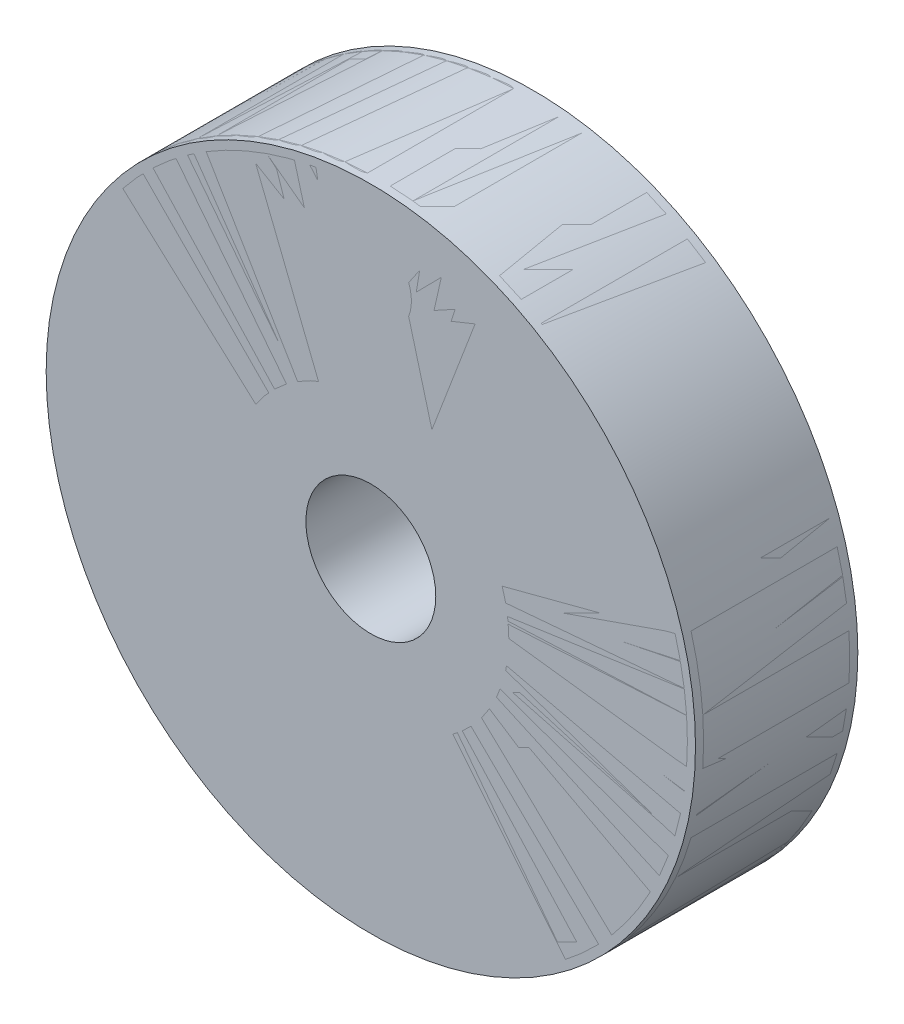
ISO-10303-21;
HEADER;
FILE_DESCRIPTION(('STEP AP214'),'2;1');
FILE_NAME('part.step','',(''),(''),'','','');
FILE_SCHEMA(('AUTOMOTIVE_DESIGN { 1 0 10303 214 1 1 1 1 }'));
ENDSEC;
DATA;
#1=APPLICATION_CONTEXT('core data for automotive mechanical design processes');
#2=APPLICATION_PROTOCOL_DEFINITION('international standard','automotive_design',2000,#1);
#3=PRODUCT_CONTEXT('',#1,'mechanical');
#4=PRODUCT('Part','Part','',(#3));
#5=PRODUCT_RELATED_PRODUCT_CATEGORY('part','',(#4));
#6=PRODUCT_DEFINITION_FORMATION('','',#4);
#7=PRODUCT_DEFINITION_CONTEXT('part definition',#1,'design');
#8=PRODUCT_DEFINITION('design','',#6,#7);
#9=PRODUCT_DEFINITION_SHAPE('','',#8);
#10=(LENGTH_UNIT() NAMED_UNIT(*) SI_UNIT(.MILLI.,.METRE.));
#11=(NAMED_UNIT(*) PLANE_ANGLE_UNIT() SI_UNIT($,.RADIAN.));
#12=(NAMED_UNIT(*) SI_UNIT($,.STERADIAN.) SOLID_ANGLE_UNIT());
#13=UNCERTAINTY_MEASURE_WITH_UNIT(LENGTH_MEASURE(1.E-05),#10,'distance_accuracy_value','');
#14=(GEOMETRIC_REPRESENTATION_CONTEXT(3) GLOBAL_UNCERTAINTY_ASSIGNED_CONTEXT((#13)) GLOBAL_UNIT_ASSIGNED_CONTEXT((#10,
#11,#12)) REPRESENTATION_CONTEXT('',''));
#15=CARTESIAN_POINT('',(0.,0.,0.));
#16=DIRECTION('',(0.,0.,1.));
#17=DIRECTION('',(1.,0.,0.));
#18=AXIS2_PLACEMENT_3D('',#15,#16,#17);
#19=CARTESIAN_POINT('',(0.,0.,0.));
#20=DIRECTION('',(0.,0.,1.));
#21=DIRECTION('',(1.,0.,0.));
#22=AXIS2_PLACEMENT_3D('',#19,#20,#21);
#23=CYLINDRICAL_SURFACE('',#22,4.);
#24=CARTESIAN_POINT('',(0.,0.,0.5));
#25=DIRECTION('',(0.,0.,1.));
#26=DIRECTION('',(1.,0.,0.));
#27=AXIS2_PLACEMENT_3D('',#24,#25,#26);
#28=CIRCLE('',#27,4.);
#29=CARTESIAN_POINT('',(4.,0.,0.5));
#30=VERTEX_POINT('',#29);
#31=EDGE_CURVE('E72',#30,#30,#28,.F.);
#32=ORIENTED_EDGE('',*,*,#31,.T.);
#33=EDGE_LOOP('',(#32));
#34=FACE_BOUND('',#33,.T.);
#35=CARTESIAN_POINT('',(0.,0.,6.));
#36=DIRECTION('',(0.,0.,1.));
#37=DIRECTION('',(1.,0.,0.));
#38=AXIS2_PLACEMENT_3D('',#35,#36,#37);
#39=CIRCLE('',#38,4.);
#40=CARTESIAN_POINT('',(4.,0.,6.));
#41=VERTEX_POINT('',#40);
#42=EDGE_CURVE('E96',#41,#41,#39,.F.);
#43=ORIENTED_EDGE('',*,*,#42,.F.);
#44=EDGE_LOOP('',(#43));
#45=FACE_BOUND('',#44,.T.);
#46=ADVANCED_FACE('F40',(#34,#45),#23,.F.);
#47=CARTESIAN_POINT('',(0.,0.,10.));
#48=DIRECTION('',(0.,0.,-1.));
#49=DIRECTION('',(-1.,0.,0.));
#50=AXIS2_PLACEMENT_3D('',#47,#48,#49);
#51=CYLINDRICAL_SURFACE('',#50,20.);
#52=CARTESIAN_POINT('',(0.,0.,9.5));
#53=DIRECTION('',(0.,0.,1.));
#54=DIRECTION('',(1.,0.,0.));
#55=AXIS2_PLACEMENT_3D('',#52,#53,#54);
#56=CIRCLE('',#55,20.);
#57=CARTESIAN_POINT('',(20.,0.,9.5));
#58=VERTEX_POINT('',#57);
#59=EDGE_CURVE('E87',#58,#58,#56,.F.);
#60=ORIENTED_EDGE('',*,*,#59,.T.);
#61=EDGE_LOOP('',(#60));
#62=FACE_BOUND('',#61,.T.);
#63=CARTESIAN_POINT('',(0.,0.,0.5));
#64=DIRECTION('',(0.,0.,1.));
#65=DIRECTION('',(1.,0.,0.));
#66=AXIS2_PLACEMENT_3D('',#63,#64,#65);
#67=CIRCLE('',#66,20.);
#68=CARTESIAN_POINT('',(20.,0.,0.5));
#69=VERTEX_POINT('',#68);
#70=EDGE_CURVE('E90',#69,#69,#67,.T.);
#71=ORIENTED_EDGE('',*,*,#70,.T.);
#72=EDGE_LOOP('',(#71));
#73=FACE_BOUND('',#72,.T.);
#74=ADVANCED_FACE('F122',(#62,#73),#51,.T.);
#75=CARTESIAN_POINT('',(0.,0.,10.));
#76=DIRECTION('',(0.,0.,1.));
#77=DIRECTION('',(1.,0.,0.));
#78=AXIS2_PLACEMENT_3D('',#75,#76,#77);
#79=PLANE('',#78);
#80=CARTESIAN_POINT('',(0.,-14.9988008907231,10.));
#81=DIRECTION('',(0.,0.,1.));
#82=DIRECTION('',(1.,0.,0.));
#83=AXIS2_PLACEMENT_3D('',#80,#81,#82);
#84=CIRCLE('',#83,2.5);
#85=CARTESIAN_POINT('',(2.5,-14.9988008907231,10.));
#86=VERTEX_POINT('',#85);
#87=EDGE_CURVE('E60',#86,#86,#84,.F.);
#88=ORIENTED_EDGE('',*,*,#87,.T.);
#89=EDGE_LOOP('',(#88));
#90=FACE_BOUND('',#89,.T.);
#91=CARTESIAN_POINT('',(0.,15.,10.));
#92=DIRECTION('',(0.,0.,1.));
#93=DIRECTION('',(1.,0.,0.));
#94=AXIS2_PLACEMENT_3D('',#91,#92,#93);
#95=CIRCLE('',#94,2.5);
#96=CARTESIAN_POINT('',(2.5,15.,10.));
#97=VERTEX_POINT('',#96);
#98=EDGE_CURVE('E63',#97,#97,#95,.F.);
#99=ORIENTED_EDGE('',*,*,#98,.T.);
#100=EDGE_LOOP('',(#99));
#101=FACE_BOUND('',#100,.T.);
#102=CARTESIAN_POINT('',(0.,0.,10.));
#103=DIRECTION('',(0.,0.,1.));
#104=DIRECTION('',(1.,0.,0.));
#105=AXIS2_PLACEMENT_3D('',#102,#103,#104);
#106=CIRCLE('',#105,8.50000000000001);
#107=CARTESIAN_POINT('',(8.50000000000001,0.,10.));
#108=VERTEX_POINT('',#107);
#109=EDGE_CURVE('E78',#108,#108,#106,.F.);
#110=ORIENTED_EDGE('',*,*,#109,.T.);
#111=EDGE_LOOP('',(#110));
#112=FACE_BOUND('',#111,.T.);
#113=CARTESIAN_POINT('',(0.,0.,10.));
#114=DIRECTION('',(0.,0.,1.));
#115=DIRECTION('',(1.,0.,0.));
#116=AXIS2_PLACEMENT_3D('',#113,#114,#115);
#117=CIRCLE('',#116,19.5);
#118=CARTESIAN_POINT('',(19.5,0.,10.));
#119=VERTEX_POINT('',#118);
#120=EDGE_CURVE('E93',#119,#119,#117,.T.);
#121=ORIENTED_EDGE('',*,*,#120,.T.);
#122=EDGE_LOOP('',(#121));
#123=FACE_BOUND('',#122,.T.);
#124=ADVANCED_FACE('F127',(#90,#101,#112,#123),#79,.T.);
#125=CARTESIAN_POINT('',(0.,0.,0.));
#126=DIRECTION('',(0.,0.,1.));
#127=DIRECTION('',(1.,0.,0.));
#128=AXIS2_PLACEMENT_3D('',#125,#126,#127);
#129=PLANE('',#128);
#130=CARTESIAN_POINT('',(0.,-14.9988008907231,0.));
#131=DIRECTION('',(0.,0.,1.));
#132=DIRECTION('',(1.,0.,0.));
#133=AXIS2_PLACEMENT_3D('',#130,#131,#132);
#134=CIRCLE('',#133,2.5);
#135=CARTESIAN_POINT('',(2.5,-14.9988008907231,0.));
#136=VERTEX_POINT('',#135);
#137=EDGE_CURVE('E11',#136,#136,#134,.T.);
#138=ORIENTED_EDGE('',*,*,#137,.T.);
#139=EDGE_LOOP('',(#138));
#140=FACE_BOUND('',#139,.T.);
#141=CARTESIAN_POINT('',(0.,15.,0.));
#142=DIRECTION('',(0.,0.,1.));
#143=DIRECTION('',(1.,0.,0.));
#144=AXIS2_PLACEMENT_3D('',#141,#142,#143);
#145=CIRCLE('',#144,2.5);
#146=CARTESIAN_POINT('',(2.5,15.,0.));
#147=VERTEX_POINT('',#146);
#148=EDGE_CURVE('E47',#147,#147,#145,.T.);
#149=ORIENTED_EDGE('',*,*,#148,.T.);
#150=EDGE_LOOP('',(#149));
#151=FACE_BOUND('',#150,.T.);
#152=CARTESIAN_POINT('',(0.,0.,0.));
#153=DIRECTION('',(0.,0.,1.));
#154=DIRECTION('',(1.,0.,0.));
#155=AXIS2_PLACEMENT_3D('',#152,#153,#154);
#156=CIRCLE('',#155,4.5);
#157=CARTESIAN_POINT('',(4.5,0.,0.));
#158=VERTEX_POINT('',#157);
#159=EDGE_CURVE('E75',#158,#158,#156,.T.);
#160=ORIENTED_EDGE('',*,*,#159,.T.);
#161=EDGE_LOOP('',(#160));
#162=FACE_BOUND('',#161,.T.);
#163=CARTESIAN_POINT('',(0.,0.,0.));
#164=DIRECTION('',(0.,0.,1.));
#165=DIRECTION('',(1.,0.,0.));
#166=AXIS2_PLACEMENT_3D('',#163,#164,#165);
#167=CIRCLE('',#166,19.5);
#168=CARTESIAN_POINT('',(19.5,0.,0.));
#169=VERTEX_POINT('',#168);
#170=EDGE_CURVE('E84',#169,#169,#167,.F.);
#171=ORIENTED_EDGE('',*,*,#170,.T.);
#172=EDGE_LOOP('',(#171));
#173=FACE_BOUND('',#172,.T.);
#174=ADVANCED_FACE('F118',(#140,#151,#162,#173),#129,.F.);
#175=CARTESIAN_POINT('',(0.,0.,6.));
#176=DIRECTION('',(0.,0.,1.));
#177=DIRECTION('',(1.,0.,0.));
#178=AXIS2_PLACEMENT_3D('',#175,#176,#177);
#179=PLANE('',#178);
#180=CARTESIAN_POINT('',(0.,0.,6.));
#181=DIRECTION('',(0.,0.,1.));
#182=DIRECTION('',(1.,0.,0.));
#183=AXIS2_PLACEMENT_3D('',#180,#181,#182);
#184=CIRCLE('',#183,8.);
#185=CARTESIAN_POINT('',(8.,0.,6.));
#186=VERTEX_POINT('',#185);
#187=EDGE_CURVE('E99',#186,#186,#184,.T.);
#188=ORIENTED_EDGE('',*,*,#187,.T.);
#189=EDGE_LOOP('',(#188));
#190=FACE_BOUND('',#189,.T.);
#191=ORIENTED_EDGE('',*,*,#42,.T.);
#192=EDGE_LOOP('',(#191));
#193=FACE_BOUND('',#192,.T.);
#194=ADVANCED_FACE('F103',(#190,#193),#179,.T.);
#195=CARTESIAN_POINT('',(0.,0.,6.));
#196=DIRECTION('',(0.,0.,1.));
#197=DIRECTION('',(1.,0.,0.));
#198=AXIS2_PLACEMENT_3D('',#195,#196,#197);
#199=CYLINDRICAL_SURFACE('',#198,8.);
#200=CARTESIAN_POINT('',(0.,0.,9.49999999999999));
#201=DIRECTION('',(0.,0.,1.));
#202=DIRECTION('',(1.,0.,0.));
#203=AXIS2_PLACEMENT_3D('',#200,#201,#202);
#204=CIRCLE('',#203,8.);
#205=CARTESIAN_POINT('',(8.,0.,9.49999999999999));
#206=VERTEX_POINT('',#205);
#207=EDGE_CURVE('E81',#206,#206,#204,.T.);
#208=ORIENTED_EDGE('',*,*,#207,.T.);
#209=EDGE_LOOP('',(#208));
#210=FACE_BOUND('',#209,.T.);
#211=ORIENTED_EDGE('',*,*,#187,.F.);
#212=EDGE_LOOP('',(#211));
#213=FACE_BOUND('',#212,.T.);
#214=ADVANCED_FACE('F106',(#210,#213),#199,.F.);
#215=CARTESIAN_POINT('',(0.,-14.9988008907231,0.));
#216=DIRECTION('',(0.,0.,1.));
#217=DIRECTION('',(1.,0.,0.));
#218=AXIS2_PLACEMENT_3D('',#215,#216,#217);
#219=CYLINDRICAL_SURFACE('',#218,2.);
#220=CARTESIAN_POINT('',(0.,-14.9988008907231,9.50000000000001));
#221=DIRECTION('',(0.,0.,1.));
#222=DIRECTION('',(1.,0.,0.));
#223=AXIS2_PLACEMENT_3D('',#220,#221,#222);
#224=CIRCLE('',#223,2.);
#225=CARTESIAN_POINT('',(2.,-14.9988008907231,9.50000000000001));
#226=VERTEX_POINT('',#225);
#227=EDGE_CURVE('E66',#226,#226,#224,.T.);
#228=ORIENTED_EDGE('',*,*,#227,.T.);
#229=EDGE_LOOP('',(#228));
#230=FACE_BOUND('',#229,.T.);
#231=CARTESIAN_POINT('',(0.,-14.9988008907231,0.500000000000003));
#232=DIRECTION('',(0.,0.,1.));
#233=DIRECTION('',(1.,0.,0.));
#234=AXIS2_PLACEMENT_3D('',#231,#232,#233);
#235=CIRCLE('',#234,2.);
#236=CARTESIAN_POINT('',(2.,-14.9988008907231,0.500000000000003));
#237=VERTEX_POINT('',#236);
#238=EDGE_CURVE('E69',#237,#237,#235,.F.);
#239=ORIENTED_EDGE('',*,*,#238,.T.);
#240=EDGE_LOOP('',(#239));
#241=FACE_BOUND('',#240,.T.);
#242=ADVANCED_FACE('F108',(#230,#241),#219,.F.);
#243=CARTESIAN_POINT('',(0.,15.,0.));
#244=DIRECTION('',(0.,0.,1.));
#245=DIRECTION('',(1.,0.,0.));
#246=AXIS2_PLACEMENT_3D('',#243,#244,#245);
#247=CYLINDRICAL_SURFACE('',#246,2.);
#248=CARTESIAN_POINT('',(0.,15.,9.50000000000001));
#249=DIRECTION('',(0.,0.,1.));
#250=DIRECTION('',(1.,0.,0.));
#251=AXIS2_PLACEMENT_3D('',#248,#249,#250);
#252=CIRCLE('',#251,2.);
#253=CARTESIAN_POINT('',(2.,15.,9.50000000000001));
#254=VERTEX_POINT('',#253);
#255=EDGE_CURVE('E51',#254,#254,#252,.T.);
#256=ORIENTED_EDGE('',*,*,#255,.T.);
#257=EDGE_LOOP('',(#256));
#258=FACE_BOUND('',#257,.T.);
#259=CARTESIAN_POINT('',(0.,15.,0.500000000000003));
#260=DIRECTION('',(0.,0.,1.));
#261=DIRECTION('',(1.,0.,0.));
#262=AXIS2_PLACEMENT_3D('',#259,#260,#261);
#263=CIRCLE('',#262,2.);
#264=CARTESIAN_POINT('',(2.,15.,0.500000000000003));
#265=VERTEX_POINT('',#264);
#266=EDGE_CURVE('E55',#265,#265,#263,.F.);
#267=ORIENTED_EDGE('',*,*,#266,.T.);
#268=EDGE_LOOP('',(#267));
#269=FACE_BOUND('',#268,.T.);
#270=ADVANCED_FACE('F115',(#258,#269),#247,.F.);
#271=CARTESIAN_POINT('',(0.,0.,9.5));
#272=DIRECTION('',(0.,0.,1.));
#273=DIRECTION('',(1.,0.,0.));
#274=AXIS2_PLACEMENT_3D('',#271,#272,#273);
#275=TOROIDAL_SURFACE('',#274,19.5,0.5);
#276=ORIENTED_EDGE('',*,*,#59,.F.);
#277=EDGE_LOOP('',(#276));
#278=FACE_BOUND('',#277,.T.);
#279=ORIENTED_EDGE('',*,*,#120,.F.);
#280=EDGE_LOOP('',(#279));
#281=FACE_BOUND('',#280,.T.);
#282=ADVANCED_FACE('F137',(#278,#281),#275,.T.);
#283=CARTESIAN_POINT('',(0.,0.,0.5));
#284=DIRECTION('',(0.,0.,1.));
#285=DIRECTION('',(1.,0.,0.));
#286=AXIS2_PLACEMENT_3D('',#283,#284,#285);
#287=TOROIDAL_SURFACE('',#286,19.5,0.5);
#288=ORIENTED_EDGE('',*,*,#170,.F.);
#289=EDGE_LOOP('',(#288));
#290=FACE_BOUND('',#289,.T.);
#291=ORIENTED_EDGE('',*,*,#70,.F.);
#292=EDGE_LOOP('',(#291));
#293=FACE_BOUND('',#292,.T.);
#294=ADVANCED_FACE('F140',(#290,#293),#287,.T.);
#295=CARTESIAN_POINT('',(0.,0.,9.49999999999999));
#296=DIRECTION('',(0.,0.,1.));
#297=DIRECTION('',(1.,0.,0.));
#298=AXIS2_PLACEMENT_3D('',#295,#296,#297);
#299=CONICAL_SURFACE('',#298,8.,0.78539816339745);
#300=ORIENTED_EDGE('',*,*,#109,.F.);
#301=EDGE_LOOP('',(#300));
#302=FACE_BOUND('',#301,.T.);
#303=ORIENTED_EDGE('',*,*,#207,.F.);
#304=EDGE_LOOP('',(#303));
#305=FACE_BOUND('',#304,.T.);
#306=ADVANCED_FACE('F144',(#302,#305),#299,.F.);
#307=CARTESIAN_POINT('',(0.,0.,0.5));
#308=DIRECTION('',(0.,0.,1.));
#309=DIRECTION('',(1.,0.,0.));
#310=AXIS2_PLACEMENT_3D('',#307,#308,#309);
#311=TOROIDAL_SURFACE('',#310,4.5,0.5);
#312=ORIENTED_EDGE('',*,*,#31,.F.);
#313=EDGE_LOOP('',(#312));
#314=FACE_BOUND('',#313,.T.);
#315=ORIENTED_EDGE('',*,*,#159,.F.);
#316=EDGE_LOOP('',(#315));
#317=FACE_BOUND('',#316,.T.);
#318=ADVANCED_FACE('F148',(#314,#317),#311,.T.);
#319=CARTESIAN_POINT('',(0.,-14.9988008907231,9.50000000000001));
#320=DIRECTION('',(0.,0.,1.));
#321=DIRECTION('',(1.,0.,0.));
#322=AXIS2_PLACEMENT_3D('',#319,#320,#321);
#323=CONICAL_SURFACE('',#322,2.,0.785398163397455);
#324=ORIENTED_EDGE('',*,*,#87,.F.);
#325=EDGE_LOOP('',(#324));
#326=FACE_BOUND('',#325,.T.);
#327=ORIENTED_EDGE('',*,*,#227,.F.);
#328=EDGE_LOOP('',(#327));
#329=FACE_BOUND('',#328,.T.);
#330=ADVANCED_FACE('F152',(#326,#329),#323,.F.);
#331=CARTESIAN_POINT('',(0.,15.,9.50000000000001));
#332=DIRECTION('',(0.,0.,1.));
#333=DIRECTION('',(1.,0.,0.));
#334=AXIS2_PLACEMENT_3D('',#331,#332,#333);
#335=CONICAL_SURFACE('',#334,2.,0.785398163397455);
#336=ORIENTED_EDGE('',*,*,#98,.F.);
#337=EDGE_LOOP('',(#336));
#338=FACE_BOUND('',#337,.T.);
#339=ORIENTED_EDGE('',*,*,#255,.F.);
#340=EDGE_LOOP('',(#339));
#341=FACE_BOUND('',#340,.T.);
#342=ADVANCED_FACE('F156',(#338,#341),#335,.F.);
#343=CARTESIAN_POINT('',(0.,-14.9988008907231,0.));
#344=DIRECTION('',(0.,0.,-1.));
#345=DIRECTION('',(-1.,0.,0.));
#346=AXIS2_PLACEMENT_3D('',#343,#344,#345);
#347=CONICAL_SURFACE('',#346,2.5,0.785398163397448);
#348=ORIENTED_EDGE('',*,*,#238,.F.);
#349=EDGE_LOOP('',(#348));
#350=FACE_BOUND('',#349,.T.);
#351=ORIENTED_EDGE('',*,*,#137,.F.);
#352=EDGE_LOOP('',(#351));
#353=FACE_BOUND('',#352,.T.);
#354=ADVANCED_FACE('F159',(#350,#353),#347,.F.);
#355=CARTESIAN_POINT('',(0.,15.,0.));
#356=DIRECTION('',(0.,0.,-1.));
#357=DIRECTION('',(-1.,0.,0.));
#358=AXIS2_PLACEMENT_3D('',#355,#356,#357);
#359=CONICAL_SURFACE('',#358,2.5,0.785398163397448);
#360=ORIENTED_EDGE('',*,*,#266,.F.);
#361=EDGE_LOOP('',(#360));
#362=FACE_BOUND('',#361,.T.);
#363=ORIENTED_EDGE('',*,*,#148,.F.);
#364=EDGE_LOOP('',(#363));
#365=FACE_BOUND('',#364,.T.);
#366=ADVANCED_FACE('F42',(#362,#365),#359,.F.);
#367=CLOSED_SHELL('',(#46,#74,#124,#174,#194,#214,#242,#270,#282,#294,#306,#318,#330,#342,#354,#366));
#368=MANIFOLD_SOLID_BREP('B2',#367);
#369=CARTESIAN_POINT('',(0.,0.,0.));
#370=DIRECTION('',(0.,0.,1.));
#371=DIRECTION('',(1.,0.,0.));
#372=AXIS2_PLACEMENT_3D('',#369,#370,#371);
#373=PLANE('',#372);
#374=CARTESIAN_POINT('',(0.,0.,0.));
#375=DIRECTION('',(0.,0.,1.));
#376=DIRECTION('',(1.,0.,0.));
#377=AXIS2_PLACEMENT_3D('',#374,#375,#376);
#378=CIRCLE('',#377,20.);
#379=CARTESIAN_POINT('',(20.,0.,0.));
#380=VERTEX_POINT('',#379);
#381=EDGE_CURVE('E301',#380,#380,#378,.T.);
#382=ORIENTED_EDGE('',*,*,#381,.F.);
#383=EDGE_LOOP('',(#382));
#384=FACE_BOUND('',#383,.T.);
#385=CARTESIAN_POINT('',(0.,0.,0.));
#386=DIRECTION('',(0.,0.,1.));
#387=DIRECTION('',(1.,0.,0.));
#388=AXIS2_PLACEMENT_3D('',#385,#386,#387);
#389=CIRCLE('',#388,8.);
#390=CARTESIAN_POINT('',(8.,0.,0.));
#391=VERTEX_POINT('',#390);
#392=EDGE_CURVE('E310',#391,#391,#389,.T.);
#393=ORIENTED_EDGE('',*,*,#392,.T.);
#394=EDGE_LOOP('',(#393));
#395=FACE_BOUND('',#394,.T.);
#396=ADVANCED_FACE('F293',(#384,#395),#373,.F.);
#397=CARTESIAN_POINT('',(0.,0.,10.));
#398=DIRECTION('',(0.,0.,1.));
#399=DIRECTION('',(1.,0.,0.));
#400=AXIS2_PLACEMENT_3D('',#397,#398,#399);
#401=PLANE('',#400);
#402=CARTESIAN_POINT('',(0.,0.,10.));
#403=DIRECTION('',(0.,0.,1.));
#404=DIRECTION('',(1.,0.,0.));
#405=AXIS2_PLACEMENT_3D('',#402,#403,#404);
#406=CIRCLE('',#405,20.);
#407=CARTESIAN_POINT('',(20.,0.,10.));
#408=VERTEX_POINT('',#407);
#409=EDGE_CURVE('E39',#408,#408,#406,.T.);
#410=ORIENTED_EDGE('',*,*,#409,.T.);
#411=EDGE_LOOP('',(#410));
#412=FACE_BOUND('',#411,.T.);
#413=CARTESIAN_POINT('',(0.,0.,10.));
#414=DIRECTION('',(0.,0.,1.));
#415=DIRECTION('',(1.,0.,0.));
#416=AXIS2_PLACEMENT_3D('',#413,#414,#415);
#417=CIRCLE('',#416,4.);
#418=CARTESIAN_POINT('',(4.,0.,10.));
#419=VERTEX_POINT('',#418);
#420=EDGE_CURVE('E306',#419,#419,#417,.F.);
#421=ORIENTED_EDGE('',*,*,#420,.T.);
#422=EDGE_LOOP('',(#421));
#423=FACE_BOUND('',#422,.T.);
#424=ADVANCED_FACE('F330',(#412,#423),#401,.T.);
#425=CARTESIAN_POINT('',(0.,0.,10.));
#426=DIRECTION('',(0.,0.,-1.));
#427=DIRECTION('',(-1.,0.,0.));
#428=AXIS2_PLACEMENT_3D('',#425,#426,#427);
#429=CYLINDRICAL_SURFACE('',#428,20.);
#430=ORIENTED_EDGE('',*,*,#409,.F.);
#431=EDGE_LOOP('',(#430));
#432=FACE_BOUND('',#431,.T.);
#433=ORIENTED_EDGE('',*,*,#381,.T.);
#434=EDGE_LOOP('',(#433));
#435=FACE_BOUND('',#434,.T.);
#436=ADVANCED_FACE('F295',(#432,#435),#429,.T.);
#437=CARTESIAN_POINT('',(0.,0.,14.));
#438=DIRECTION('',(0.,0.,-1.));
#439=DIRECTION('',(-1.,0.,0.));
#440=AXIS2_PLACEMENT_3D('',#437,#438,#439);
#441=CYLINDRICAL_SURFACE('',#440,4.);
#442=CARTESIAN_POINT('',(0.,0.,4.));
#443=DIRECTION('',(0.,0.,1.));
#444=DIRECTION('',(1.,0.,0.));
#445=AXIS2_PLACEMENT_3D('',#442,#443,#444);
#446=CIRCLE('',#445,4.);
#447=CARTESIAN_POINT('',(4.,0.,4.));
#448=VERTEX_POINT('',#447);
#449=EDGE_CURVE('E297',#448,#448,#446,.T.);
#450=ORIENTED_EDGE('',*,*,#449,.F.);
#451=EDGE_LOOP('',(#450));
#452=FACE_BOUND('',#451,.T.);
#453=ORIENTED_EDGE('',*,*,#420,.F.);
#454=EDGE_LOOP('',(#453));
#455=FACE_BOUND('',#454,.T.);
#456=ADVANCED_FACE('F323',(#452,#455),#441,.F.);
#457=CARTESIAN_POINT('',(0.,0.,4.));
#458=DIRECTION('',(0.,0.,-1.));
#459=DIRECTION('',(-1.,0.,0.));
#460=AXIS2_PLACEMENT_3D('',#457,#458,#459);
#461=CYLINDRICAL_SURFACE('',#460,8.);
#462=CARTESIAN_POINT('',(0.,0.,4.));
#463=DIRECTION('',(0.,0.,1.));
#464=DIRECTION('',(1.,0.,0.));
#465=AXIS2_PLACEMENT_3D('',#462,#463,#464);
#466=CIRCLE('',#465,8.);
#467=CARTESIAN_POINT('',(8.,0.,4.));
#468=VERTEX_POINT('',#467);
#469=EDGE_CURVE('E313',#468,#468,#466,.T.);
#470=ORIENTED_EDGE('',*,*,#469,.T.);
#471=EDGE_LOOP('',(#470));
#472=FACE_BOUND('',#471,.T.);
#473=ORIENTED_EDGE('',*,*,#392,.F.);
#474=EDGE_LOOP('',(#473));
#475=FACE_BOUND('',#474,.T.);
#476=ADVANCED_FACE('F326',(#472,#475),#461,.F.);
#477=CARTESIAN_POINT('',(0.,0.,4.));
#478=DIRECTION('',(0.,0.,1.));
#479=DIRECTION('',(1.,0.,0.));
#480=AXIS2_PLACEMENT_3D('',#477,#478,#479);
#481=PLANE('',#480);
#482=ORIENTED_EDGE('',*,*,#449,.T.);
#483=EDGE_LOOP('',(#482));
#484=FACE_BOUND('',#483,.T.);
#485=ORIENTED_EDGE('',*,*,#469,.F.);
#486=EDGE_LOOP('',(#485));
#487=FACE_BOUND('',#486,.T.);
#488=ADVANCED_FACE('F320',(#484,#487),#481,.F.);
#489=CLOSED_SHELL('',(#396,#424,#436,#456,#476,#488));
#490=MANIFOLD_SOLID_BREP('B6_NOT_SHOWN',#489);
#491=ADVANCED_BREP_SHAPE_REPRESENTATION('',(#18,#368,#490),#14);
#492=SHAPE_DEFINITION_REPRESENTATION(#9,#491);
ENDSEC;
END-ISO-10303-21;
